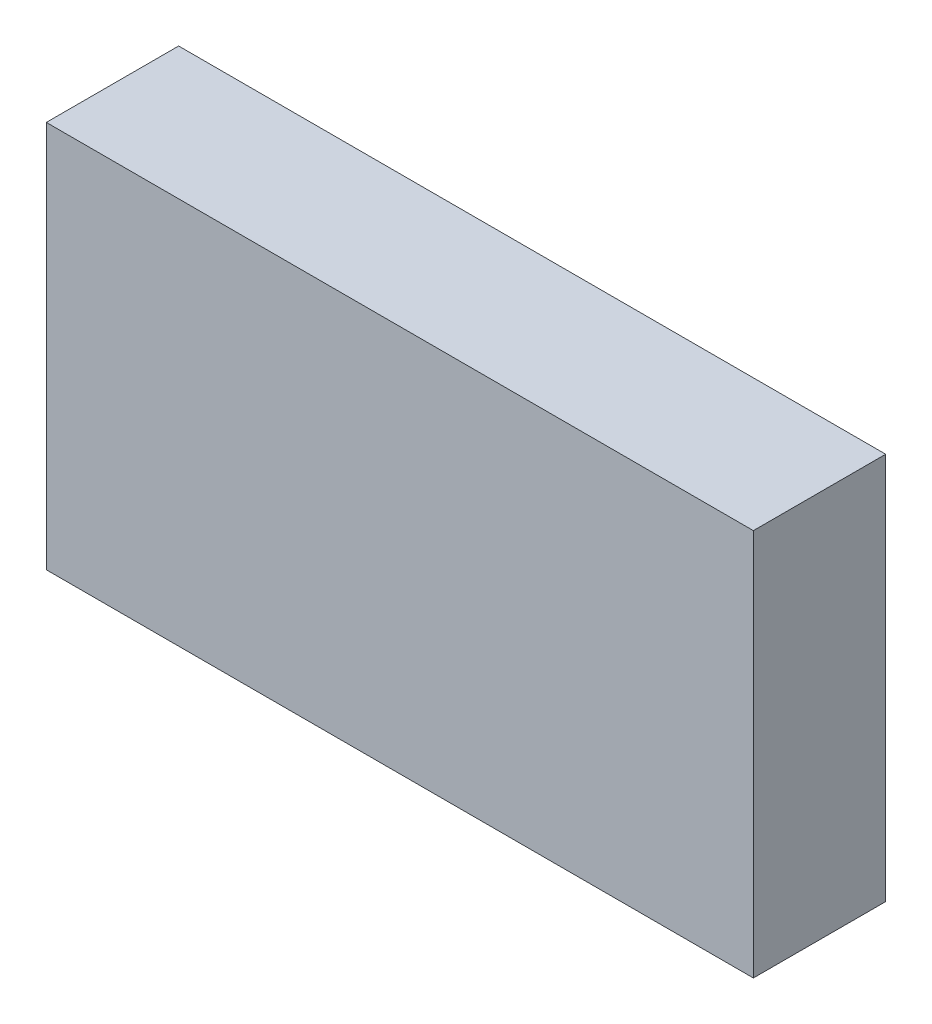
ISO-10303-21;
HEADER;
FILE_DESCRIPTION(('STEP AP214'),'2;1');
FILE_NAME('part.step','',(''),(''),'','','');
FILE_SCHEMA(('AUTOMOTIVE_DESIGN { 1 0 10303 214 1 1 1 1 }'));
ENDSEC;
DATA;
#1=APPLICATION_CONTEXT('core data for automotive mechanical design processes');
#2=APPLICATION_PROTOCOL_DEFINITION('international standard','automotive_design',2000,#1);
#3=PRODUCT_CONTEXT('',#1,'mechanical');
#4=PRODUCT('Part','Part','',(#3));
#5=PRODUCT_RELATED_PRODUCT_CATEGORY('part','',(#4));
#6=PRODUCT_DEFINITION_FORMATION('','',#4);
#7=PRODUCT_DEFINITION_CONTEXT('part definition',#1,'design');
#8=PRODUCT_DEFINITION('design','',#6,#7);
#9=PRODUCT_DEFINITION_SHAPE('','',#8);
#10=(LENGTH_UNIT() NAMED_UNIT(*) SI_UNIT(.MILLI.,.METRE.));
#11=(NAMED_UNIT(*) PLANE_ANGLE_UNIT() SI_UNIT($,.RADIAN.));
#12=(NAMED_UNIT(*) SI_UNIT($,.STERADIAN.) SOLID_ANGLE_UNIT());
#13=UNCERTAINTY_MEASURE_WITH_UNIT(LENGTH_MEASURE(1.E-05),#10,'distance_accuracy_value','');
#14=(GEOMETRIC_REPRESENTATION_CONTEXT(3) GLOBAL_UNCERTAINTY_ASSIGNED_CONTEXT((#13)) GLOBAL_UNIT_ASSIGNED_CONTEXT((#10,
#11,#12)) REPRESENTATION_CONTEXT('',''));
#15=CARTESIAN_POINT('',(0.,0.,0.));
#16=DIRECTION('',(0.,0.,1.));
#17=DIRECTION('',(1.,0.,0.));
#18=AXIS2_PLACEMENT_3D('',#15,#16,#17);
#19=CARTESIAN_POINT('',(-20.0525,15.5175,-3.619));
#20=DIRECTION('',(-1.,0.,0.));
#21=DIRECTION('',(0.,0.,1.));
#22=AXIS2_PLACEMENT_3D('',#19,#20,#21);
#23=PLANE('',#22);
#24=DIRECTION('',(0.,0.,1.));
#25=VECTOR('',#24,1.);
#26=CARTESIAN_POINT('',(-20.0525,-1.8635,-3.619));
#27=LINE('',#26,#25);
#28=CARTESIAN_POINT('',(-20.0525,-1.8635,-3.619));
#29=VERTEX_POINT('',#28);
#30=CARTESIAN_POINT('',(-20.0525,-1.8635,2.317));
#31=VERTEX_POINT('',#30);
#32=EDGE_CURVE('E42',#29,#31,#27,.T.);
#33=ORIENTED_EDGE('',*,*,#32,.T.);
#34=DIRECTION('',(0.,-1.,0.));
#35=VECTOR('',#34,1.);
#36=CARTESIAN_POINT('',(-20.0525,15.5175,2.317));
#37=LINE('',#36,#35);
#38=CARTESIAN_POINT('',(-20.0525,15.5175,2.317));
#39=VERTEX_POINT('',#38);
#40=EDGE_CURVE('E83',#39,#31,#37,.T.);
#41=ORIENTED_EDGE('',*,*,#40,.F.);
#42=DIRECTION('',(0.,0.,1.));
#43=VECTOR('',#42,1.);
#44=CARTESIAN_POINT('',(-20.0525,15.5175,-3.619));
#45=LINE('',#44,#43);
#46=CARTESIAN_POINT('',(-20.0525,15.5175,-3.619));
#47=VERTEX_POINT('',#46);
#48=EDGE_CURVE('E11',#47,#39,#45,.T.);
#49=ORIENTED_EDGE('',*,*,#48,.F.);
#50=DIRECTION('',(0.,-1.,0.));
#51=VECTOR('',#50,1.);
#52=CARTESIAN_POINT('',(-20.0525,15.5175,-3.619));
#53=LINE('',#52,#51);
#54=EDGE_CURVE('E85',#47,#29,#53,.T.);
#55=ORIENTED_EDGE('',*,*,#54,.T.);
#56=EDGE_LOOP('',(#33,#41,#49,#55));
#57=FACE_BOUND('',#56,.T.);
#58=ADVANCED_FACE('F41',(#57),#23,.T.);
#59=CARTESIAN_POINT('',(11.6665,15.5175,-3.619));
#60=DIRECTION('',(0.,1.,0.));
#61=DIRECTION('',(0.,0.,1.));
#62=AXIS2_PLACEMENT_3D('',#59,#60,#61);
#63=PLANE('',#62);
#64=ORIENTED_EDGE('',*,*,#48,.T.);
#65=DIRECTION('',(-1.,0.,0.));
#66=VECTOR('',#65,1.);
#67=CARTESIAN_POINT('',(11.6665,15.5175,2.317));
#68=LINE('',#67,#66);
#69=CARTESIAN_POINT('',(11.6665,15.5175,2.317));
#70=VERTEX_POINT('',#69);
#71=EDGE_CURVE('E97',#70,#39,#68,.T.);
#72=ORIENTED_EDGE('',*,*,#71,.F.);
#73=DIRECTION('',(0.,0.,1.));
#74=VECTOR('',#73,1.);
#75=CARTESIAN_POINT('',(11.6665,15.5175,-3.619));
#76=LINE('',#75,#74);
#77=CARTESIAN_POINT('',(11.6665,15.5175,-3.619));
#78=VERTEX_POINT('',#77);
#79=EDGE_CURVE('E47',#78,#70,#76,.T.);
#80=ORIENTED_EDGE('',*,*,#79,.F.);
#81=DIRECTION('',(-1.,0.,0.));
#82=VECTOR('',#81,1.);
#83=CARTESIAN_POINT('',(11.6665,15.5175,-3.619));
#84=LINE('',#83,#82);
#85=EDGE_CURVE('E90',#78,#47,#84,.T.);
#86=ORIENTED_EDGE('',*,*,#85,.T.);
#87=EDGE_LOOP('',(#64,#72,#80,#86));
#88=FACE_BOUND('',#87,.T.);
#89=ADVANCED_FACE('F111',(#88),#63,.T.);
#90=CARTESIAN_POINT('',(11.6665,-1.8635,-3.619));
#91=DIRECTION('',(1.,0.,0.));
#92=DIRECTION('',(0.,0.,-1.));
#93=AXIS2_PLACEMENT_3D('',#90,#91,#92);
#94=PLANE('',#93);
#95=ORIENTED_EDGE('',*,*,#79,.T.);
#96=DIRECTION('',(0.,1.,0.));
#97=VECTOR('',#96,1.);
#98=CARTESIAN_POINT('',(11.6665,-1.8635,2.317));
#99=LINE('',#98,#97);
#100=CARTESIAN_POINT('',(11.6665,-1.8635,2.317));
#101=VERTEX_POINT('',#100);
#102=EDGE_CURVE('E92',#101,#70,#99,.T.);
#103=ORIENTED_EDGE('',*,*,#102,.F.);
#104=DIRECTION('',(0.,0.,1.));
#105=VECTOR('',#104,1.);
#106=CARTESIAN_POINT('',(11.6665,-1.8635,-3.619));
#107=LINE('',#106,#105);
#108=CARTESIAN_POINT('',(11.6665,-1.8635,-3.619));
#109=VERTEX_POINT('',#108);
#110=EDGE_CURVE('E86',#109,#101,#107,.T.);
#111=ORIENTED_EDGE('',*,*,#110,.F.);
#112=DIRECTION('',(0.,1.,0.));
#113=VECTOR('',#112,1.);
#114=CARTESIAN_POINT('',(11.6665,-1.8635,-3.619));
#115=LINE('',#114,#113);
#116=EDGE_CURVE('E107',#109,#78,#115,.T.);
#117=ORIENTED_EDGE('',*,*,#116,.T.);
#118=EDGE_LOOP('',(#95,#103,#111,#117));
#119=FACE_BOUND('',#118,.T.);
#120=ADVANCED_FACE('F108',(#119),#94,.T.);
#121=CARTESIAN_POINT('',(-20.0525,-1.8635,-3.619));
#122=DIRECTION('',(0.,-1.,0.));
#123=DIRECTION('',(0.,0.,-1.));
#124=AXIS2_PLACEMENT_3D('',#121,#122,#123);
#125=PLANE('',#124);
#126=ORIENTED_EDGE('',*,*,#110,.T.);
#127=DIRECTION('',(1.,0.,0.));
#128=VECTOR('',#127,1.);
#129=CARTESIAN_POINT('',(-20.0525,-1.8635,2.317));
#130=LINE('',#129,#128);
#131=EDGE_CURVE('E87',#31,#101,#130,.T.);
#132=ORIENTED_EDGE('',*,*,#131,.F.);
#133=ORIENTED_EDGE('',*,*,#32,.F.);
#134=DIRECTION('',(1.,0.,0.));
#135=VECTOR('',#134,1.);
#136=CARTESIAN_POINT('',(-20.0525,-1.8635,-3.619));
#137=LINE('',#136,#135);
#138=EDGE_CURVE('E101',#29,#109,#137,.T.);
#139=ORIENTED_EDGE('',*,*,#138,.T.);
#140=EDGE_LOOP('',(#126,#132,#133,#139));
#141=FACE_BOUND('',#140,.T.);
#142=ADVANCED_FACE('F89',(#141),#125,.T.);
#143=CARTESIAN_POINT('',(0.,0.,-3.619));
#144=DIRECTION('',(0.,0.,1.));
#145=DIRECTION('',(1.,0.,0.));
#146=AXIS2_PLACEMENT_3D('',#143,#144,#145);
#147=PLANE('',#146);
#148=ORIENTED_EDGE('',*,*,#54,.F.);
#149=ORIENTED_EDGE('',*,*,#85,.F.);
#150=ORIENTED_EDGE('',*,*,#116,.F.);
#151=ORIENTED_EDGE('',*,*,#138,.F.);
#152=EDGE_LOOP('',(#148,#149,#150,#151));
#153=FACE_BOUND('',#152,.T.);
#154=ADVANCED_FACE('F113',(#153),#147,.F.);
#155=CARTESIAN_POINT('',(0.,0.,2.317));
#156=DIRECTION('',(0.,0.,1.));
#157=DIRECTION('',(1.,0.,0.));
#158=AXIS2_PLACEMENT_3D('',#155,#156,#157);
#159=PLANE('',#158);
#160=ORIENTED_EDGE('',*,*,#40,.T.);
#161=ORIENTED_EDGE('',*,*,#131,.T.);
#162=ORIENTED_EDGE('',*,*,#102,.T.);
#163=ORIENTED_EDGE('',*,*,#71,.T.);
#164=EDGE_LOOP('',(#160,#161,#162,#163));
#165=FACE_BOUND('',#164,.T.);
#166=ADVANCED_FACE('F100',(#165),#159,.T.);
#167=CLOSED_SHELL('',(#58,#89,#120,#142,#154,#166));
#168=MANIFOLD_SOLID_BREP('B2',#167);
#169=ADVANCED_BREP_SHAPE_REPRESENTATION('',(#18,#168),#14);
#170=SHAPE_DEFINITION_REPRESENTATION(#9,#169);
ENDSEC;
END-ISO-10303-21;
